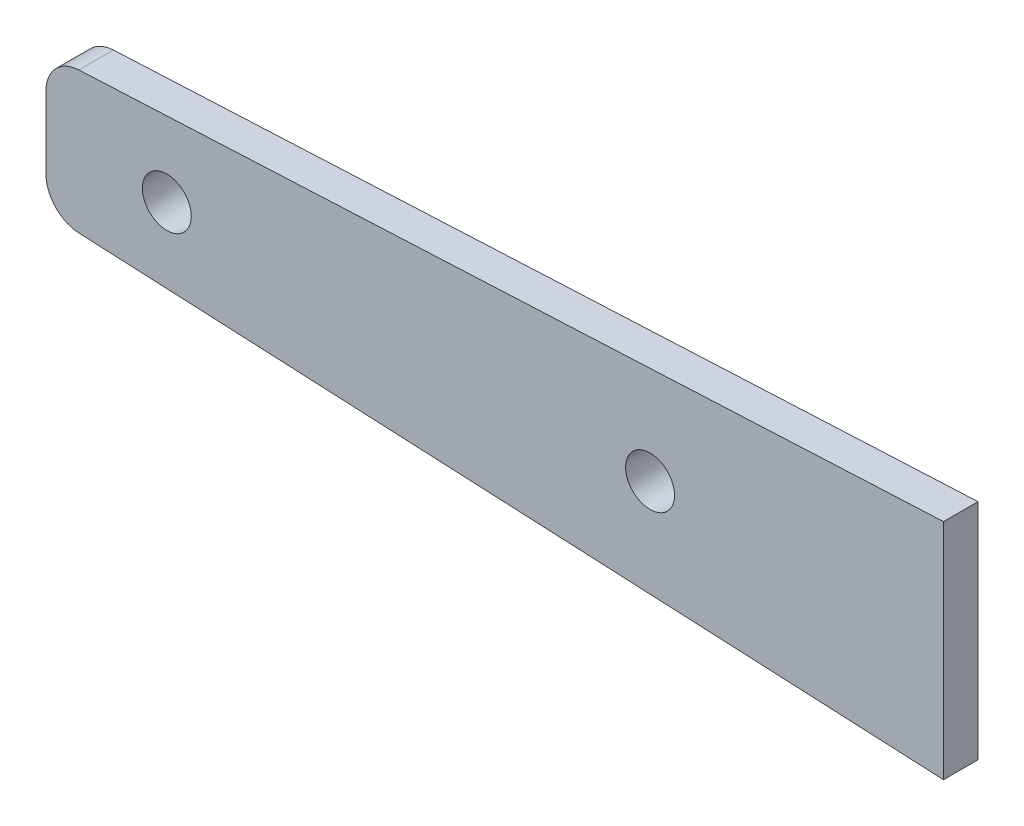
ISO-10303-21;
HEADER;
FILE_DESCRIPTION(('STEP AP214'),'2;1');
FILE_NAME('part.step','',(''),(''),'','','');
FILE_SCHEMA(('AUTOMOTIVE_DESIGN { 1 0 10303 214 1 1 1 1 }'));
ENDSEC;
DATA;
#1=APPLICATION_CONTEXT('core data for automotive mechanical design processes');
#2=APPLICATION_PROTOCOL_DEFINITION('international standard','automotive_design',2000,#1);
#3=PRODUCT_CONTEXT('',#1,'mechanical');
#4=PRODUCT('Part','Part','',(#3));
#5=PRODUCT_RELATED_PRODUCT_CATEGORY('part','',(#4));
#6=PRODUCT_DEFINITION_FORMATION('','',#4);
#7=PRODUCT_DEFINITION_CONTEXT('part definition',#1,'design');
#8=PRODUCT_DEFINITION('design','',#6,#7);
#9=PRODUCT_DEFINITION_SHAPE('','',#8);
#10=(LENGTH_UNIT() NAMED_UNIT(*) SI_UNIT(.MILLI.,.METRE.));
#11=(NAMED_UNIT(*) PLANE_ANGLE_UNIT() SI_UNIT($,.RADIAN.));
#12=(NAMED_UNIT(*) SI_UNIT($,.STERADIAN.) SOLID_ANGLE_UNIT());
#13=UNCERTAINTY_MEASURE_WITH_UNIT(LENGTH_MEASURE(1.E-05),#10,'distance_accuracy_value','');
#14=(GEOMETRIC_REPRESENTATION_CONTEXT(3) GLOBAL_UNCERTAINTY_ASSIGNED_CONTEXT((#13)) GLOBAL_UNIT_ASSIGNED_CONTEXT((#10,
#11,#12)) REPRESENTATION_CONTEXT('',''));
#15=CARTESIAN_POINT('',(0.,0.,0.));
#16=DIRECTION('',(0.,0.,1.));
#17=DIRECTION('',(1.,0.,0.));
#18=AXIS2_PLACEMENT_3D('',#15,#16,#17);
#19=CARTESIAN_POINT('',(-0.377121040723982,-7.91954185520362,3.175));
#20=DIRECTION('',(0.0475651494154494,0.998868137724438,0.));
#21=DIRECTION('',(-0.998868137724438,0.0475651494154494,0.));
#22=AXIS2_PLACEMENT_3D('',#19,#20,#21);
#23=PLANE('',#22);
#24=DIRECTION('',(0.998868137724438,-0.0475651494154494,0.));
#25=VECTOR('',#24,1.);
#26=CARTESIAN_POINT('',(-0.377121040723982,-7.91954185520362,3.175));
#27=LINE('',#26,#25);
#28=CARTESIAN_POINT('',(-30.3135193493941,-6.49399907860028,3.175));
#29=VERTEX_POINT('',#28);
#30=CARTESIAN_POINT('',(49.2125,-10.2809523809524,3.175));
#31=VERTEX_POINT('',#30);
#32=EDGE_CURVE('E105',#29,#31,#27,.T.);
#33=ORIENTED_EDGE('',*,*,#32,.F.);
#34=DIRECTION('',(0.,0.,-1.));
#35=VECTOR('',#34,1.);
#36=CARTESIAN_POINT('',(-30.3135193493941,-6.49399907860028,3.175));
#37=LINE('',#36,#35);
#38=CARTESIAN_POINT('',(-30.3135193493941,-6.49399907860028,0.));
#39=VERTEX_POINT('',#38);
#40=EDGE_CURVE('E125',#29,#39,#37,.T.);
#41=ORIENTED_EDGE('',*,*,#40,.T.);
#42=DIRECTION('',(0.998868137724438,-0.0475651494154494,0.));
#43=VECTOR('',#42,1.);
#44=CARTESIAN_POINT('',(-0.377121040723982,-7.91954185520362,0.));
#45=LINE('',#44,#43);
#46=CARTESIAN_POINT('',(49.2125,-10.2809523809524,0.));
#47=VERTEX_POINT('',#46);
#48=EDGE_CURVE('E120',#39,#47,#45,.T.);
#49=ORIENTED_EDGE('',*,*,#48,.T.);
#50=DIRECTION('',(0.,0.,-1.));
#51=VECTOR('',#50,1.);
#52=CARTESIAN_POINT('',(49.2125,-10.2809523809524,3.175));
#53=LINE('',#52,#51);
#54=EDGE_CURVE('E118',#31,#47,#53,.T.);
#55=ORIENTED_EDGE('',*,*,#54,.F.);
#56=EDGE_LOOP('',(#33,#41,#49,#55));
#57=FACE_BOUND('',#56,.T.);
#58=ADVANCED_FACE('F50',(#57),#23,.F.);
#59=CARTESIAN_POINT('',(49.2125,0.,3.175));
#60=DIRECTION('',(1.,0.,0.));
#61=DIRECTION('',(0.,0.,-1.));
#62=AXIS2_PLACEMENT_3D('',#59,#60,#61);
#63=PLANE('',#62);
#64=DIRECTION('',(0.,-1.,0.));
#65=VECTOR('',#64,1.);
#66=CARTESIAN_POINT('',(49.2125,0.,0.));
#67=LINE('',#66,#65);
#68=CARTESIAN_POINT('',(49.2125,10.2809523809524,0.));
#69=VERTEX_POINT('',#68);
#70=EDGE_CURVE('E174',#69,#47,#67,.T.);
#71=ORIENTED_EDGE('',*,*,#70,.F.);
#72=DIRECTION('',(0.,0.,-1.));
#73=VECTOR('',#72,1.);
#74=CARTESIAN_POINT('',(49.2125,10.2809523809524,3.175));
#75=LINE('',#74,#73);
#76=CARTESIAN_POINT('',(49.2125,10.2809523809524,3.175));
#77=VERTEX_POINT('',#76);
#78=EDGE_CURVE('E126',#77,#69,#75,.T.);
#79=ORIENTED_EDGE('',*,*,#78,.F.);
#80=DIRECTION('',(0.,-1.,0.));
#81=VECTOR('',#80,1.);
#82=CARTESIAN_POINT('',(49.2125,0.,3.175));
#83=LINE('',#82,#81);
#84=EDGE_CURVE('E109',#77,#31,#83,.T.);
#85=ORIENTED_EDGE('',*,*,#84,.T.);
#86=ORIENTED_EDGE('',*,*,#54,.T.);
#87=EDGE_LOOP('',(#71,#79,#85,#86));
#88=FACE_BOUND('',#87,.T.);
#89=ADVANCED_FACE('F129',(#88),#63,.T.);
#90=CARTESIAN_POINT('',(-0.377121040723982,7.91954185520362,3.175));
#91=DIRECTION('',(-0.0475651494154494,0.998868137724438,0.));
#92=DIRECTION('',(-0.998868137724438,-0.0475651494154494,0.));
#93=AXIS2_PLACEMENT_3D('',#90,#91,#92);
#94=PLANE('',#93);
#95=DIRECTION('',(0.998868137724438,0.0475651494154494,0.));
#96=VECTOR('',#95,1.);
#97=CARTESIAN_POINT('',(-0.377121040723982,7.91954185520362,0.));
#98=LINE('',#97,#96);
#99=CARTESIAN_POINT('',(-30.3135193493941,6.49399907860028,0.));
#100=VERTEX_POINT('',#99);
#101=EDGE_CURVE('E171',#100,#69,#98,.T.);
#102=ORIENTED_EDGE('',*,*,#101,.F.);
#103=DIRECTION('',(0.,0.,-1.));
#104=VECTOR('',#103,1.);
#105=CARTESIAN_POINT('',(-30.3135193493941,6.49399907860028,3.175));
#106=LINE('',#105,#104);
#107=CARTESIAN_POINT('',(-30.3135193493941,6.49399907860028,3.175));
#108=VERTEX_POINT('',#107);
#109=EDGE_CURVE('E12',#100,#108,#106,.F.);
#110=ORIENTED_EDGE('',*,*,#109,.T.);
#111=DIRECTION('',(0.998868137724438,0.0475651494154494,0.));
#112=VECTOR('',#111,1.);
#113=CARTESIAN_POINT('',(-0.377121040723982,7.91954185520362,3.175));
#114=LINE('',#113,#112);
#115=EDGE_CURVE('E132',#108,#77,#114,.T.);
#116=ORIENTED_EDGE('',*,*,#115,.T.);
#117=ORIENTED_EDGE('',*,*,#78,.T.);
#118=EDGE_LOOP('',(#102,#110,#116,#117));
#119=FACE_BOUND('',#118,.T.);
#120=ADVANCED_FACE('F188',(#119),#94,.T.);
#121=CARTESIAN_POINT('',(-33.3375,0.,3.175));
#122=DIRECTION('',(1.,0.,0.));
#123=DIRECTION('',(0.,0.,-1.));
#124=AXIS2_PLACEMENT_3D('',#121,#122,#123);
#125=PLANE('',#124);
#126=DIRECTION('',(0.,-1.,0.));
#127=VECTOR('',#126,1.);
#128=CARTESIAN_POINT('',(-33.3375,0.,0.));
#129=LINE('',#128,#127);
#130=CARTESIAN_POINT('',(-33.3375,3.32259274132519,0.));
#131=VERTEX_POINT('',#130);
#132=CARTESIAN_POINT('',(-33.3375,-3.32259274132519,0.));
#133=VERTEX_POINT('',#132);
#134=EDGE_CURVE('E115',#131,#133,#129,.T.);
#135=ORIENTED_EDGE('',*,*,#134,.T.);
#136=DIRECTION('',(0.,0.,-1.));
#137=VECTOR('',#136,1.);
#138=CARTESIAN_POINT('',(-33.3375,-3.32259274132519,3.175));
#139=LINE('',#138,#137);
#140=CARTESIAN_POINT('',(-33.3375,-3.32259274132519,3.175));
#141=VERTEX_POINT('',#140);
#142=EDGE_CURVE('E72',#133,#141,#139,.F.);
#143=ORIENTED_EDGE('',*,*,#142,.T.);
#144=DIRECTION('',(0.,-1.,0.));
#145=VECTOR('',#144,1.);
#146=CARTESIAN_POINT('',(-33.3375,0.,3.175));
#147=LINE('',#146,#145);
#148=CARTESIAN_POINT('',(-33.3375,3.32259274132519,3.175));
#149=VERTEX_POINT('',#148);
#150=EDGE_CURVE('E135',#149,#141,#147,.T.);
#151=ORIENTED_EDGE('',*,*,#150,.F.);
#152=DIRECTION('',(0.,0.,-1.));
#153=VECTOR('',#152,1.);
#154=CARTESIAN_POINT('',(-33.3375,3.32259274132519,0.));
#155=LINE('',#154,#153);
#156=EDGE_CURVE('E155',#149,#131,#155,.T.);
#157=ORIENTED_EDGE('',*,*,#156,.T.);
#158=EDGE_LOOP('',(#135,#143,#151,#157));
#159=FACE_BOUND('',#158,.T.);
#160=ADVANCED_FACE('F190',(#159),#125,.F.);
#161=CARTESIAN_POINT('',(0.,0.,3.175));
#162=DIRECTION('',(0.,0.,1.));
#163=DIRECTION('',(1.,0.,0.));
#164=AXIS2_PLACEMENT_3D('',#161,#162,#163);
#165=PLANE('',#164);
#166=CARTESIAN_POINT('',(-22.225,0.,3.175));
#167=DIRECTION('',(0.,0.,1.));
#168=DIRECTION('',(1.,0.,0.));
#169=AXIS2_PLACEMENT_3D('',#166,#167,#168);
#170=CIRCLE('',#169,2.24999999999999);
#171=CARTESIAN_POINT('',(-19.975,0.,3.175));
#172=VERTEX_POINT('',#171);
#173=EDGE_CURVE('E241',#172,#172,#170,.T.);
#174=ORIENTED_EDGE('',*,*,#173,.F.);
#175=EDGE_LOOP('',(#174));
#176=FACE_BOUND('',#175,.T.);
#177=CARTESIAN_POINT('',(22.225,0.,3.175));
#178=DIRECTION('',(0.,0.,1.));
#179=DIRECTION('',(1.,0.,0.));
#180=AXIS2_PLACEMENT_3D('',#177,#178,#179);
#181=CIRCLE('',#180,2.24999999999999);
#182=CARTESIAN_POINT('',(24.475,0.,3.175));
#183=VERTEX_POINT('',#182);
#184=EDGE_CURVE('E233',#183,#183,#181,.T.);
#185=ORIENTED_EDGE('',*,*,#184,.F.);
#186=EDGE_LOOP('',(#185));
#187=FACE_BOUND('',#186,.T.);
#188=ORIENTED_EDGE('',*,*,#150,.T.);
#189=CARTESIAN_POINT('',(-30.1625,-3.32259274132519,3.175));
#190=DIRECTION('',(0.,0.,1.));
#191=DIRECTION('',(1.,0.,0.));
#192=AXIS2_PLACEMENT_3D('',#189,#190,#191);
#193=CIRCLE('',#192,3.175);
#194=EDGE_CURVE('E59',#141,#29,#193,.T.);
#195=ORIENTED_EDGE('',*,*,#194,.T.);
#196=ORIENTED_EDGE('',*,*,#32,.T.);
#197=ORIENTED_EDGE('',*,*,#84,.F.);
#198=ORIENTED_EDGE('',*,*,#115,.F.);
#199=CARTESIAN_POINT('',(-30.1625,3.32259274132519,3.175));
#200=DIRECTION('',(0.,0.,1.));
#201=DIRECTION('',(1.,0.,0.));
#202=AXIS2_PLACEMENT_3D('',#199,#200,#201);
#203=CIRCLE('',#202,3.175);
#204=EDGE_CURVE('E149',#108,#149,#203,.T.);
#205=ORIENTED_EDGE('',*,*,#204,.T.);
#206=EDGE_LOOP('',(#188,#195,#196,#197,#198,#205));
#207=FACE_BOUND('',#206,.T.);
#208=ADVANCED_FACE('F107',(#176,#187,#207),#165,.T.);
#209=CARTESIAN_POINT('',(0.,0.,0.));
#210=DIRECTION('',(0.,0.,1.));
#211=DIRECTION('',(1.,0.,0.));
#212=AXIS2_PLACEMENT_3D('',#209,#210,#211);
#213=PLANE('',#212);
#214=CARTESIAN_POINT('',(-22.225,0.,0.));
#215=DIRECTION('',(0.,0.,1.));
#216=DIRECTION('',(1.,0.,0.));
#217=AXIS2_PLACEMENT_3D('',#214,#215,#216);
#218=CIRCLE('',#217,2.25);
#219=CARTESIAN_POINT('',(-19.975,0.,0.));
#220=VERTEX_POINT('',#219);
#221=EDGE_CURVE('E229',#220,#220,#218,.T.);
#222=ORIENTED_EDGE('',*,*,#221,.T.);
#223=EDGE_LOOP('',(#222));
#224=FACE_BOUND('',#223,.T.);
#225=CARTESIAN_POINT('',(22.225,0.,0.));
#226=DIRECTION('',(0.,0.,1.));
#227=DIRECTION('',(1.,0.,0.));
#228=AXIS2_PLACEMENT_3D('',#225,#226,#227);
#229=CIRCLE('',#228,2.25);
#230=CARTESIAN_POINT('',(24.475,0.,0.));
#231=VERTEX_POINT('',#230);
#232=EDGE_CURVE('E178',#231,#231,#229,.T.);
#233=ORIENTED_EDGE('',*,*,#232,.T.);
#234=EDGE_LOOP('',(#233));
#235=FACE_BOUND('',#234,.T.);
#236=ORIENTED_EDGE('',*,*,#48,.F.);
#237=CARTESIAN_POINT('',(-30.1625,-3.32259274132519,0.));
#238=DIRECTION('',(0.,0.,1.));
#239=DIRECTION('',(1.,0.,0.));
#240=AXIS2_PLACEMENT_3D('',#237,#238,#239);
#241=CIRCLE('',#240,3.175);
#242=EDGE_CURVE('E159',#39,#133,#241,.F.);
#243=ORIENTED_EDGE('',*,*,#242,.T.);
#244=ORIENTED_EDGE('',*,*,#134,.F.);
#245=CARTESIAN_POINT('',(-30.1625,3.32259274132519,0.));
#246=DIRECTION('',(0.,0.,1.));
#247=DIRECTION('',(1.,0.,0.));
#248=AXIS2_PLACEMENT_3D('',#245,#246,#247);
#249=CIRCLE('',#248,3.175);
#250=EDGE_CURVE('E162',#131,#100,#249,.F.);
#251=ORIENTED_EDGE('',*,*,#250,.T.);
#252=ORIENTED_EDGE('',*,*,#101,.T.);
#253=ORIENTED_EDGE('',*,*,#70,.T.);
#254=EDGE_LOOP('',(#236,#243,#244,#251,#252,#253));
#255=FACE_BOUND('',#254,.T.);
#256=ADVANCED_FACE('F186',(#224,#235,#255),#213,.F.);
#257=CARTESIAN_POINT('',(22.225,0.,3.175));
#258=DIRECTION('',(0.,0.,1.));
#259=DIRECTION('',(1.,0.,0.));
#260=AXIS2_PLACEMENT_3D('',#257,#258,#259);
#261=CYLINDRICAL_SURFACE('',#260,2.24999999999999);
#262=ORIENTED_EDGE('',*,*,#232,.F.);
#263=EDGE_LOOP('',(#262));
#264=FACE_BOUND('',#263,.T.);
#265=ORIENTED_EDGE('',*,*,#184,.T.);
#266=EDGE_LOOP('',(#265));
#267=FACE_BOUND('',#266,.T.);
#268=ADVANCED_FACE('F214',(#264,#267),#261,.F.);
#269=CARTESIAN_POINT('',(-22.225,0.,3.175));
#270=DIRECTION('',(0.,0.,1.));
#271=DIRECTION('',(1.,0.,0.));
#272=AXIS2_PLACEMENT_3D('',#269,#270,#271);
#273=CYLINDRICAL_SURFACE('',#272,2.24999999999999);
#274=ORIENTED_EDGE('',*,*,#221,.F.);
#275=EDGE_LOOP('',(#274));
#276=FACE_BOUND('',#275,.T.);
#277=ORIENTED_EDGE('',*,*,#173,.T.);
#278=EDGE_LOOP('',(#277));
#279=FACE_BOUND('',#278,.T.);
#280=ADVANCED_FACE('F209',(#276,#279),#273,.F.);
#281=CARTESIAN_POINT('',(-30.1625,-3.32259274132519,3.175));
#282=DIRECTION('',(0.,0.,-1.));
#283=DIRECTION('',(-1.,0.,0.));
#284=AXIS2_PLACEMENT_3D('',#281,#282,#283);
#285=CYLINDRICAL_SURFACE('',#284,3.175);
#286=ORIENTED_EDGE('',*,*,#194,.F.);
#287=ORIENTED_EDGE('',*,*,#142,.F.);
#288=ORIENTED_EDGE('',*,*,#242,.F.);
#289=ORIENTED_EDGE('',*,*,#40,.F.);
#290=EDGE_LOOP('',(#286,#287,#288,#289));
#291=FACE_BOUND('',#290,.T.);
#292=ADVANCED_FACE('F184',(#291),#285,.T.);
#293=CARTESIAN_POINT('',(-30.1625,3.32259274132519,3.175));
#294=DIRECTION('',(0.,0.,1.));
#295=DIRECTION('',(1.,0.,0.));
#296=AXIS2_PLACEMENT_3D('',#293,#294,#295);
#297=CYLINDRICAL_SURFACE('',#296,3.175);
#298=ORIENTED_EDGE('',*,*,#204,.F.);
#299=ORIENTED_EDGE('',*,*,#109,.F.);
#300=ORIENTED_EDGE('',*,*,#250,.F.);
#301=ORIENTED_EDGE('',*,*,#156,.F.);
#302=EDGE_LOOP('',(#298,#299,#300,#301));
#303=FACE_BOUND('',#302,.T.);
#304=ADVANCED_FACE('F52',(#303),#297,.T.);
#305=CLOSED_SHELL('',(#58,#89,#120,#160,#208,#256,#268,#280,#292,#304));
#306=MANIFOLD_SOLID_BREP('B2',#305);
#307=ADVANCED_BREP_SHAPE_REPRESENTATION('',(#18,#306),#14);
#308=SHAPE_DEFINITION_REPRESENTATION(#9,#307);
ENDSEC;
END-ISO-10303-21;
